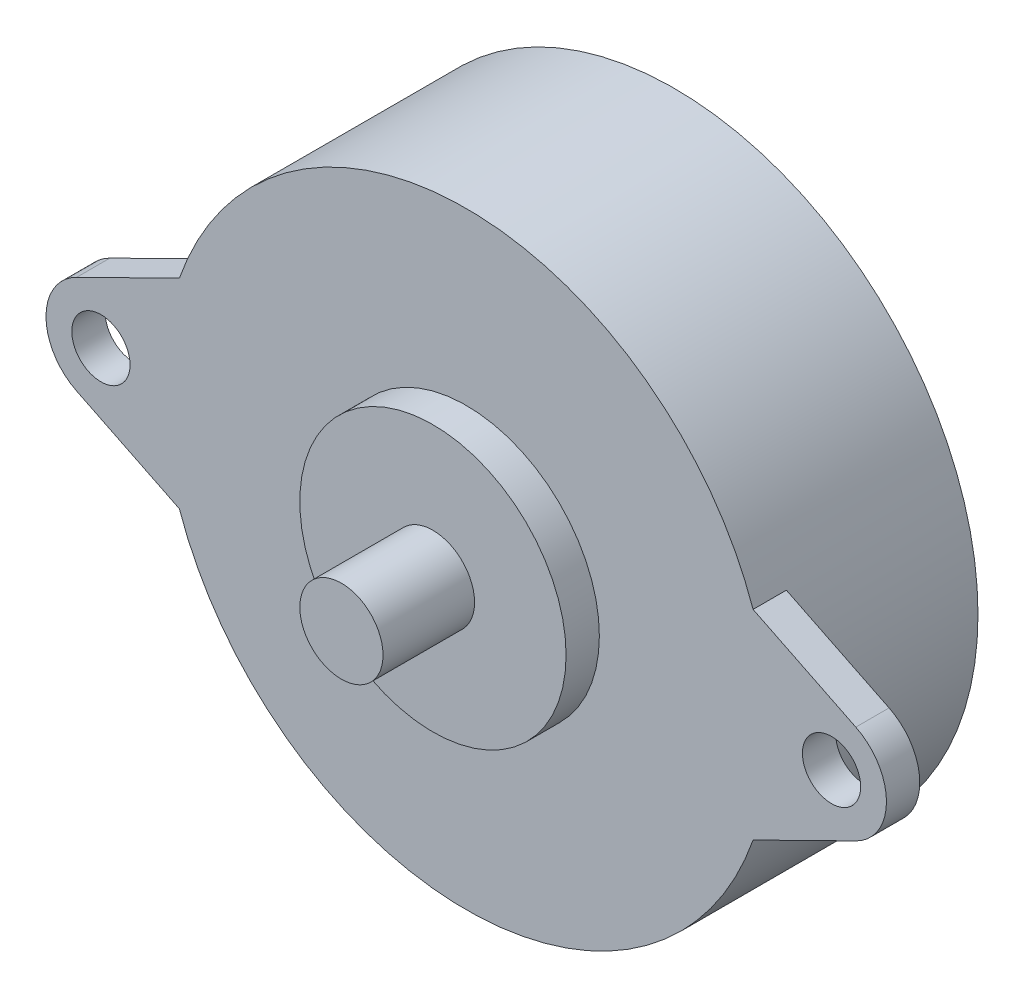
ISO-10303-21;
HEADER;
FILE_DESCRIPTION(('STEP AP214'),'2;1');
FILE_NAME('part.step','',(''),(''),'','','');
FILE_SCHEMA(('AUTOMOTIVE_DESIGN { 1 0 10303 214 1 1 1 1 }'));
ENDSEC;
DATA;
#1=APPLICATION_CONTEXT('core data for automotive mechanical design processes');
#2=APPLICATION_PROTOCOL_DEFINITION('international standard','automotive_design',2000,#1);
#3=PRODUCT_CONTEXT('',#1,'mechanical');
#4=PRODUCT('Part','Part','',(#3));
#5=PRODUCT_RELATED_PRODUCT_CATEGORY('part','',(#4));
#6=PRODUCT_DEFINITION_FORMATION('','',#4);
#7=PRODUCT_DEFINITION_CONTEXT('part definition',#1,'design');
#8=PRODUCT_DEFINITION('design','',#6,#7);
#9=PRODUCT_DEFINITION_SHAPE('','',#8);
#10=(LENGTH_UNIT() NAMED_UNIT(*) SI_UNIT(.MILLI.,.METRE.));
#11=(NAMED_UNIT(*) PLANE_ANGLE_UNIT() SI_UNIT($,.RADIAN.));
#12=(NAMED_UNIT(*) SI_UNIT($,.STERADIAN.) SOLID_ANGLE_UNIT());
#13=UNCERTAINTY_MEASURE_WITH_UNIT(LENGTH_MEASURE(1.E-05),#10,'distance_accuracy_value','');
#14=(GEOMETRIC_REPRESENTATION_CONTEXT(3) GLOBAL_UNCERTAINTY_ASSIGNED_CONTEXT((#13)) GLOBAL_UNIT_ASSIGNED_CONTEXT((#10,
#11,#12)) REPRESENTATION_CONTEXT('',''));
#15=CARTESIAN_POINT('',(0.,0.,0.));
#16=DIRECTION('',(0.,0.,1.));
#17=DIRECTION('',(1.,0.,0.));
#18=AXIS2_PLACEMENT_3D('',#15,#16,#17);
#19=CARTESIAN_POINT('',(0.,0.,12.5));
#20=DIRECTION('',(0.,0.,-1.));
#21=DIRECTION('',(-1.,0.,0.));
#22=AXIS2_PLACEMENT_3D('',#19,#20,#21);
#23=CYLINDRICAL_SURFACE('',#22,18.25);
#24=CARTESIAN_POINT('',(0.,0.,10.5));
#25=DIRECTION('',(0.,0.,-1.));
#26=DIRECTION('',(-1.,0.,0.));
#27=AXIS2_PLACEMENT_3D('',#24,#25,#26);
#28=CIRCLE('',#27,18.25);
#29=CARTESIAN_POINT('',(17.2355011531432,6.,10.5));
#30=VERTEX_POINT('',#29);
#31=CARTESIAN_POINT('',(17.2355011531432,-6.,10.5));
#32=VERTEX_POINT('',#31);
#33=EDGE_CURVE('E121',#30,#32,#28,.T.);
#34=ORIENTED_EDGE('',*,*,#33,.T.);
#35=DIRECTION('',(0.,0.,1.));
#36=VECTOR('',#35,1.);
#37=CARTESIAN_POINT('',(17.2355011531432,-6.,10.5));
#38=LINE('',#37,#36);
#39=CARTESIAN_POINT('',(17.2355011531432,-6.,12.5));
#40=VERTEX_POINT('',#39);
#41=EDGE_CURVE('E141',#32,#40,#38,.T.);
#42=ORIENTED_EDGE('',*,*,#41,.T.);
#43=CARTESIAN_POINT('',(0.,0.,12.5));
#44=DIRECTION('',(0.,0.,1.));
#45=DIRECTION('',(1.,0.,0.));
#46=AXIS2_PLACEMENT_3D('',#43,#44,#45);
#47=CIRCLE('',#46,18.25);
#48=CARTESIAN_POINT('',(-17.2355011531432,-6.,12.5));
#49=VERTEX_POINT('',#48);
#50=EDGE_CURVE('E176',#49,#40,#47,.T.);
#51=ORIENTED_EDGE('',*,*,#50,.F.);
#52=DIRECTION('',(0.,0.,1.));
#53=VECTOR('',#52,1.);
#54=CARTESIAN_POINT('',(-17.2355011531432,-6.,10.5));
#55=LINE('',#54,#53);
#56=CARTESIAN_POINT('',(-17.2355011531432,-6.,10.5));
#57=VERTEX_POINT('',#56);
#58=EDGE_CURVE('E174',#57,#49,#55,.T.);
#59=ORIENTED_EDGE('',*,*,#58,.F.);
#60=CARTESIAN_POINT('',(0.,0.,10.5));
#61=DIRECTION('',(0.,0.,-1.));
#62=DIRECTION('',(1.,0.,0.));
#63=AXIS2_PLACEMENT_3D('',#60,#61,#62);
#64=CIRCLE('',#63,18.25);
#65=CARTESIAN_POINT('',(-17.2355011531432,6.,10.5));
#66=VERTEX_POINT('',#65);
#67=EDGE_CURVE('E158',#57,#66,#64,.T.);
#68=ORIENTED_EDGE('',*,*,#67,.T.);
#69=DIRECTION('',(0.,0.,1.));
#70=VECTOR('',#69,1.);
#71=CARTESIAN_POINT('',(-17.2355011531432,6.,10.5));
#72=LINE('',#71,#70);
#73=CARTESIAN_POINT('',(-17.2355011531432,6.,12.5));
#74=VERTEX_POINT('',#73);
#75=EDGE_CURVE('E171',#66,#74,#72,.T.);
#76=ORIENTED_EDGE('',*,*,#75,.T.);
#77=CARTESIAN_POINT('',(17.2355011531432,6.,12.5));
#78=VERTEX_POINT('',#77);
#79=EDGE_CURVE('E177',#78,#74,#47,.T.);
#80=ORIENTED_EDGE('',*,*,#79,.F.);
#81=DIRECTION('',(0.,0.,1.));
#82=VECTOR('',#81,1.);
#83=CARTESIAN_POINT('',(17.2355011531432,6.,10.5));
#84=LINE('',#83,#82);
#85=EDGE_CURVE('E111',#30,#78,#84,.T.);
#86=ORIENTED_EDGE('',*,*,#85,.F.);
#87=EDGE_LOOP('',(#34,#42,#51,#59,#68,#76,#80,#86));
#88=FACE_BOUND('',#87,.T.);
#89=CARTESIAN_POINT('',(0.,0.,0.));
#90=DIRECTION('',(0.,0.,1.));
#91=DIRECTION('',(1.,0.,0.));
#92=AXIS2_PLACEMENT_3D('',#89,#90,#91);
#93=CIRCLE('',#92,18.25);
#94=CARTESIAN_POINT('',(18.25,0.,0.));
#95=VERTEX_POINT('',#94);
#96=EDGE_CURVE('E39',#95,#95,#93,.T.);
#97=ORIENTED_EDGE('',*,*,#96,.T.);
#98=EDGE_LOOP('',(#97));
#99=FACE_BOUND('',#98,.T.);
#100=ADVANCED_FACE('F36',(#88,#99),#23,.T.);
#101=CARTESIAN_POINT('',(0.,0.,12.5));
#102=DIRECTION('',(0.,0.,1.));
#103=DIRECTION('',(1.,0.,0.));
#104=AXIS2_PLACEMENT_3D('',#101,#102,#103);
#105=PLANE('',#104);
#106=CARTESIAN_POINT('',(0.,0.,12.5));
#107=DIRECTION('',(0.,0.,1.));
#108=DIRECTION('',(1.,0.,0.));
#109=AXIS2_PLACEMENT_3D('',#106,#107,#108);
#110=CIRCLE('',#109,8.);
#111=CARTESIAN_POINT('',(8.,0.,12.5));
#112=VERTEX_POINT('',#111);
#113=EDGE_CURVE('E44',#112,#112,#110,.T.);
#114=ORIENTED_EDGE('',*,*,#113,.F.);
#115=EDGE_LOOP('',(#114));
#116=FACE_BOUND('',#115,.T.);
#117=ORIENTED_EDGE('',*,*,#50,.T.);
#118=DIRECTION('',(0.89712539673719,0.441775986818137,0.));
#119=VECTOR('',#118,1.);
#120=CARTESIAN_POINT('',(23.4078607564999,-2.96051380923273,12.5));
#121=LINE('',#120,#119);
#122=CARTESIAN_POINT('',(23.4078607564999,-2.96051380923273,12.5));
#123=VERTEX_POINT('',#122);
#124=EDGE_CURVE('E125',#40,#123,#121,.T.);
#125=ORIENTED_EDGE('',*,*,#124,.T.);
#126=CARTESIAN_POINT('',(21.95,0.,12.5));
#127=DIRECTION('',(0.,0.,1.));
#128=DIRECTION('',(-1.,0.,0.));
#129=AXIS2_PLACEMENT_3D('',#126,#127,#128);
#130=CIRCLE('',#129,3.3);
#131=CARTESIAN_POINT('',(23.4078607564999,2.96051380923273,12.5));
#132=VERTEX_POINT('',#131);
#133=EDGE_CURVE('E135',#123,#132,#130,.T.);
#134=ORIENTED_EDGE('',*,*,#133,.T.);
#135=DIRECTION('',(-0.89712539673719,0.441775986818137,0.));
#136=VECTOR('',#135,1.);
#137=CARTESIAN_POINT('',(23.4078607564999,2.96051380923273,12.5));
#138=LINE('',#137,#136);
#139=EDGE_CURVE('E52',#132,#78,#138,.T.);
#140=ORIENTED_EDGE('',*,*,#139,.T.);
#141=ORIENTED_EDGE('',*,*,#79,.T.);
#142=DIRECTION('',(-0.89712539673719,-0.441775986818137,0.));
#143=VECTOR('',#142,1.);
#144=CARTESIAN_POINT('',(-23.4078607564999,2.96051380923273,12.5));
#145=LINE('',#144,#143);
#146=CARTESIAN_POINT('',(-23.4078607564999,2.96051380923273,12.5));
#147=VERTEX_POINT('',#146);
#148=EDGE_CURVE('E155',#74,#147,#145,.T.);
#149=ORIENTED_EDGE('',*,*,#148,.T.);
#150=CARTESIAN_POINT('',(-21.95,0.,12.5));
#151=DIRECTION('',(0.,0.,1.));
#152=DIRECTION('',(1.,0.,0.));
#153=AXIS2_PLACEMENT_3D('',#150,#151,#152);
#154=CIRCLE('',#153,3.3);
#155=CARTESIAN_POINT('',(-23.4078607564999,-2.96051380923273,12.5));
#156=VERTEX_POINT('',#155);
#157=EDGE_CURVE('E148',#147,#156,#154,.T.);
#158=ORIENTED_EDGE('',*,*,#157,.T.);
#159=DIRECTION('',(0.89712539673719,-0.441775986818137,0.));
#160=VECTOR('',#159,1.);
#161=CARTESIAN_POINT('',(-23.4078607564999,-2.96051380923273,12.5));
#162=LINE('',#161,#160);
#163=EDGE_CURVE('E59',#156,#49,#162,.T.);
#164=ORIENTED_EDGE('',*,*,#163,.T.);
#165=EDGE_LOOP('',(#117,#125,#134,#140,#141,#149,#158,#164));
#166=FACE_BOUND('',#165,.T.);
#167=CARTESIAN_POINT('',(-21.95,0.,12.5));
#168=DIRECTION('',(0.,0.,1.));
#169=DIRECTION('',(1.,0.,0.));
#170=AXIS2_PLACEMENT_3D('',#167,#168,#169);
#171=CIRCLE('',#170,1.75);
#172=CARTESIAN_POINT('',(-20.2,0.,12.5));
#173=VERTEX_POINT('',#172);
#174=EDGE_CURVE('E140',#173,#173,#171,.T.);
#175=ORIENTED_EDGE('',*,*,#174,.F.);
#176=EDGE_LOOP('',(#175));
#177=FACE_BOUND('',#176,.T.);
#178=CARTESIAN_POINT('',(21.95,0.,12.5));
#179=DIRECTION('',(0.,0.,1.));
#180=DIRECTION('',(1.,0.,0.));
#181=AXIS2_PLACEMENT_3D('',#178,#179,#180);
#182=CIRCLE('',#181,1.75);
#183=CARTESIAN_POINT('',(23.7,0.,12.5));
#184=VERTEX_POINT('',#183);
#185=EDGE_CURVE('E130',#184,#184,#182,.T.);
#186=ORIENTED_EDGE('',*,*,#185,.F.);
#187=EDGE_LOOP('',(#186));
#188=FACE_BOUND('',#187,.T.);
#189=ADVANCED_FACE('F190',(#116,#166,#177,#188),#105,.T.);
#190=CARTESIAN_POINT('',(0.,0.,0.));
#191=DIRECTION('',(0.,0.,1.));
#192=DIRECTION('',(1.,0.,0.));
#193=AXIS2_PLACEMENT_3D('',#190,#191,#192);
#194=PLANE('',#193);
#195=ORIENTED_EDGE('',*,*,#96,.F.);
#196=EDGE_LOOP('',(#195));
#197=FACE_BOUND('',#196,.T.);
#198=ADVANCED_FACE('F187',(#197),#194,.F.);
#199=CARTESIAN_POINT('',(-21.95,0.,10.5));
#200=DIRECTION('',(0.,0.,1.));
#201=DIRECTION('',(1.,0.,0.));
#202=AXIS2_PLACEMENT_3D('',#199,#200,#201);
#203=CYLINDRICAL_SURFACE('',#202,3.3);
#204=ORIENTED_EDGE('',*,*,#157,.F.);
#205=DIRECTION('',(0.,0.,1.));
#206=VECTOR('',#205,1.);
#207=CARTESIAN_POINT('',(-23.4078607564999,2.96051380923273,10.5));
#208=LINE('',#207,#206);
#209=CARTESIAN_POINT('',(-23.4078607564999,2.96051380923273,10.5));
#210=VERTEX_POINT('',#209);
#211=EDGE_CURVE('E169',#210,#147,#208,.T.);
#212=ORIENTED_EDGE('',*,*,#211,.F.);
#213=CARTESIAN_POINT('',(-21.95,0.,10.5));
#214=DIRECTION('',(0.,0.,1.));
#215=DIRECTION('',(1.,0.,0.));
#216=AXIS2_PLACEMENT_3D('',#213,#214,#215);
#217=CIRCLE('',#216,3.3);
#218=CARTESIAN_POINT('',(-23.4078607564999,-2.96051380923273,10.5));
#219=VERTEX_POINT('',#218);
#220=EDGE_CURVE('E151',#210,#219,#217,.T.);
#221=ORIENTED_EDGE('',*,*,#220,.T.);
#222=DIRECTION('',(0.,0.,1.));
#223=VECTOR('',#222,1.);
#224=CARTESIAN_POINT('',(-23.4078607564999,-2.96051380923273,10.5));
#225=LINE('',#224,#223);
#226=EDGE_CURVE('E164',#219,#156,#225,.T.);
#227=ORIENTED_EDGE('',*,*,#226,.T.);
#228=EDGE_LOOP('',(#204,#212,#221,#227));
#229=FACE_BOUND('',#228,.T.);
#230=ADVANCED_FACE('F189',(#229),#203,.T.);
#231=CARTESIAN_POINT('',(-23.4078607564999,2.96051380923273,10.5));
#232=DIRECTION('',(-0.441775986818137,0.89712539673719,0.));
#233=DIRECTION('',(-0.89712539673719,-0.441775986818137,0.));
#234=AXIS2_PLACEMENT_3D('',#231,#232,#233);
#235=PLANE('',#234);
#236=ORIENTED_EDGE('',*,*,#148,.F.);
#237=ORIENTED_EDGE('',*,*,#75,.F.);
#238=DIRECTION('',(-0.89712539673719,-0.441775986818137,0.));
#239=VECTOR('',#238,1.);
#240=CARTESIAN_POINT('',(-23.4078607564999,2.96051380923273,10.5));
#241=LINE('',#240,#239);
#242=EDGE_CURVE('E161',#66,#210,#241,.T.);
#243=ORIENTED_EDGE('',*,*,#242,.T.);
#244=ORIENTED_EDGE('',*,*,#211,.T.);
#245=EDGE_LOOP('',(#236,#237,#243,#244));
#246=FACE_BOUND('',#245,.T.);
#247=ADVANCED_FACE('F195',(#246),#235,.T.);
#248=CARTESIAN_POINT('',(-23.4078607564999,-2.96051380923273,10.5));
#249=DIRECTION('',(-0.441775986818137,-0.89712539673719,0.));
#250=DIRECTION('',(0.89712539673719,-0.441775986818137,0.));
#251=AXIS2_PLACEMENT_3D('',#248,#249,#250);
#252=PLANE('',#251);
#253=ORIENTED_EDGE('',*,*,#163,.F.);
#254=ORIENTED_EDGE('',*,*,#226,.F.);
#255=DIRECTION('',(0.89712539673719,-0.441775986818137,0.));
#256=VECTOR('',#255,1.);
#257=CARTESIAN_POINT('',(-23.4078607564999,-2.96051380923273,10.5));
#258=LINE('',#257,#256);
#259=EDGE_CURVE('E154',#219,#57,#258,.T.);
#260=ORIENTED_EDGE('',*,*,#259,.T.);
#261=ORIENTED_EDGE('',*,*,#58,.T.);
#262=EDGE_LOOP('',(#253,#254,#260,#261));
#263=FACE_BOUND('',#262,.T.);
#264=ADVANCED_FACE('F269',(#263),#252,.T.);
#265=CARTESIAN_POINT('',(-21.95,0.,10.5));
#266=DIRECTION('',(0.,0.,1.));
#267=DIRECTION('',(1.,0.,0.));
#268=AXIS2_PLACEMENT_3D('',#265,#266,#267);
#269=PLANE('',#268);
#270=CARTESIAN_POINT('',(-21.95,0.,10.5));
#271=DIRECTION('',(0.,0.,1.));
#272=DIRECTION('',(1.,0.,0.));
#273=AXIS2_PLACEMENT_3D('',#270,#271,#272);
#274=CIRCLE('',#273,1.75);
#275=CARTESIAN_POINT('',(-20.2,0.,10.5));
#276=VERTEX_POINT('',#275);
#277=EDGE_CURVE('E145',#276,#276,#274,.T.);
#278=ORIENTED_EDGE('',*,*,#277,.T.);
#279=EDGE_LOOP('',(#278));
#280=FACE_BOUND('',#279,.T.);
#281=ORIENTED_EDGE('',*,*,#220,.F.);
#282=ORIENTED_EDGE('',*,*,#242,.F.);
#283=ORIENTED_EDGE('',*,*,#67,.F.);
#284=ORIENTED_EDGE('',*,*,#259,.F.);
#285=EDGE_LOOP('',(#281,#282,#283,#284));
#286=FACE_BOUND('',#285,.T.);
#287=ADVANCED_FACE('F209',(#280,#286),#269,.F.);
#288=CARTESIAN_POINT('',(-21.95,0.,10.5));
#289=DIRECTION('',(0.,0.,1.));
#290=DIRECTION('',(1.,0.,0.));
#291=AXIS2_PLACEMENT_3D('',#288,#289,#290);
#292=CYLINDRICAL_SURFACE('',#291,1.75);
#293=ORIENTED_EDGE('',*,*,#277,.F.);
#294=EDGE_LOOP('',(#293));
#295=FACE_BOUND('',#294,.T.);
#296=ORIENTED_EDGE('',*,*,#174,.T.);
#297=EDGE_LOOP('',(#296));
#298=FACE_BOUND('',#297,.T.);
#299=ADVANCED_FACE('F263',(#295,#298),#292,.F.);
#300=CARTESIAN_POINT('',(21.95,0.,10.5));
#301=DIRECTION('',(0.,0.,1.));
#302=DIRECTION('',(1.,0.,0.));
#303=AXIS2_PLACEMENT_3D('',#300,#301,#302);
#304=CYLINDRICAL_SURFACE('',#303,3.3);
#305=ORIENTED_EDGE('',*,*,#133,.F.);
#306=DIRECTION('',(0.,0.,1.));
#307=VECTOR('',#306,1.);
#308=CARTESIAN_POINT('',(23.4078607564999,-2.96051380923273,10.5));
#309=LINE('',#308,#307);
#310=CARTESIAN_POINT('',(23.4078607564999,-2.96051380923273,10.5));
#311=VERTEX_POINT('',#310);
#312=EDGE_CURVE('E124',#311,#123,#309,.T.);
#313=ORIENTED_EDGE('',*,*,#312,.F.);
#314=CARTESIAN_POINT('',(21.95,0.,10.5));
#315=DIRECTION('',(0.,0.,1.));
#316=DIRECTION('',(-1.,0.,0.));
#317=AXIS2_PLACEMENT_3D('',#314,#315,#316);
#318=CIRCLE('',#317,3.3);
#319=CARTESIAN_POINT('',(23.4078607564999,2.96051380923273,10.5));
#320=VERTEX_POINT('',#319);
#321=EDGE_CURVE('E118',#311,#320,#318,.T.);
#322=ORIENTED_EDGE('',*,*,#321,.T.);
#323=DIRECTION('',(0.,0.,1.));
#324=VECTOR('',#323,1.);
#325=CARTESIAN_POINT('',(23.4078607564999,2.96051380923273,10.5));
#326=LINE('',#325,#324);
#327=EDGE_CURVE('E103',#320,#132,#326,.T.);
#328=ORIENTED_EDGE('',*,*,#327,.T.);
#329=EDGE_LOOP('',(#305,#313,#322,#328));
#330=FACE_BOUND('',#329,.T.);
#331=ADVANCED_FACE('F123',(#330),#304,.T.);
#332=CARTESIAN_POINT('',(23.4078607564999,-2.96051380923273,10.5));
#333=DIRECTION('',(0.441775986818137,-0.89712539673719,0.));
#334=DIRECTION('',(0.89712539673719,0.441775986818137,0.));
#335=AXIS2_PLACEMENT_3D('',#332,#333,#334);
#336=PLANE('',#335);
#337=ORIENTED_EDGE('',*,*,#124,.F.);
#338=ORIENTED_EDGE('',*,*,#41,.F.);
#339=DIRECTION('',(0.89712539673719,0.441775986818137,0.));
#340=VECTOR('',#339,1.);
#341=CARTESIAN_POINT('',(23.4078607564999,-2.96051380923273,10.5));
#342=LINE('',#341,#340);
#343=EDGE_CURVE('E112',#32,#311,#342,.T.);
#344=ORIENTED_EDGE('',*,*,#343,.T.);
#345=ORIENTED_EDGE('',*,*,#312,.T.);
#346=EDGE_LOOP('',(#337,#338,#344,#345));
#347=FACE_BOUND('',#346,.T.);
#348=ADVANCED_FACE('F255',(#347),#336,.T.);
#349=CARTESIAN_POINT('',(23.4078607564999,2.96051380923273,10.5));
#350=DIRECTION('',(0.441775986818137,0.89712539673719,0.));
#351=DIRECTION('',(-0.89712539673719,0.441775986818137,0.));
#352=AXIS2_PLACEMENT_3D('',#349,#350,#351);
#353=PLANE('',#352);
#354=ORIENTED_EDGE('',*,*,#139,.F.);
#355=ORIENTED_EDGE('',*,*,#327,.F.);
#356=DIRECTION('',(-0.89712539673719,0.441775986818137,0.));
#357=VECTOR('',#356,1.);
#358=CARTESIAN_POINT('',(23.4078607564999,2.96051380923273,10.5));
#359=LINE('',#358,#357);
#360=EDGE_CURVE('E106',#320,#30,#359,.T.);
#361=ORIENTED_EDGE('',*,*,#360,.T.);
#362=ORIENTED_EDGE('',*,*,#85,.T.);
#363=EDGE_LOOP('',(#354,#355,#361,#362));
#364=FACE_BOUND('',#363,.T.);
#365=ADVANCED_FACE('F105',(#364),#353,.T.);
#366=CARTESIAN_POINT('',(21.95,0.,10.5));
#367=DIRECTION('',(0.,0.,-1.));
#368=DIRECTION('',(-1.,0.,0.));
#369=AXIS2_PLACEMENT_3D('',#366,#367,#368);
#370=PLANE('',#369);
#371=CARTESIAN_POINT('',(21.95,0.,10.5));
#372=DIRECTION('',(0.,0.,1.));
#373=DIRECTION('',(1.,0.,0.));
#374=AXIS2_PLACEMENT_3D('',#371,#372,#373);
#375=CIRCLE('',#374,1.75);
#376=CARTESIAN_POINT('',(23.7,0.,10.5));
#377=VERTEX_POINT('',#376);
#378=EDGE_CURVE('E137',#377,#377,#375,.T.);
#379=ORIENTED_EDGE('',*,*,#378,.T.);
#380=EDGE_LOOP('',(#379));
#381=FACE_BOUND('',#380,.T.);
#382=ORIENTED_EDGE('',*,*,#321,.F.);
#383=ORIENTED_EDGE('',*,*,#343,.F.);
#384=ORIENTED_EDGE('',*,*,#33,.F.);
#385=ORIENTED_EDGE('',*,*,#360,.F.);
#386=EDGE_LOOP('',(#382,#383,#384,#385));
#387=FACE_BOUND('',#386,.T.);
#388=ADVANCED_FACE('F116',(#381,#387),#370,.T.);
#389=CARTESIAN_POINT('',(21.95,0.,10.5));
#390=DIRECTION('',(0.,0.,1.));
#391=DIRECTION('',(1.,0.,0.));
#392=AXIS2_PLACEMENT_3D('',#389,#390,#391);
#393=CYLINDRICAL_SURFACE('',#392,1.75);
#394=ORIENTED_EDGE('',*,*,#378,.F.);
#395=EDGE_LOOP('',(#394));
#396=FACE_BOUND('',#395,.T.);
#397=ORIENTED_EDGE('',*,*,#185,.T.);
#398=EDGE_LOOP('',(#397));
#399=FACE_BOUND('',#398,.T.);
#400=ADVANCED_FACE('F244',(#396,#399),#393,.F.);
#401=CARTESIAN_POINT('',(0.,0.,14.5));
#402=DIRECTION('',(0.,0.,-1.));
#403=DIRECTION('',(-1.,0.,0.));
#404=AXIS2_PLACEMENT_3D('',#401,#402,#403);
#405=CYLINDRICAL_SURFACE('',#404,8.);
#406=CARTESIAN_POINT('',(0.,0.,14.5));
#407=DIRECTION('',(0.,0.,1.));
#408=DIRECTION('',(1.,0.,0.));
#409=AXIS2_PLACEMENT_3D('',#406,#407,#408);
#410=CIRCLE('',#409,8.);
#411=CARTESIAN_POINT('',(8.,0.,14.5));
#412=VERTEX_POINT('',#411);
#413=EDGE_CURVE('E218',#412,#412,#410,.T.);
#414=ORIENTED_EDGE('',*,*,#413,.F.);
#415=EDGE_LOOP('',(#414));
#416=FACE_BOUND('',#415,.T.);
#417=ORIENTED_EDGE('',*,*,#113,.T.);
#418=EDGE_LOOP('',(#417));
#419=FACE_BOUND('',#418,.T.);
#420=ADVANCED_FACE('F239',(#416,#419),#405,.T.);
#421=CARTESIAN_POINT('',(0.,0.,14.5));
#422=DIRECTION('',(0.,0.,1.));
#423=DIRECTION('',(1.,0.,0.));
#424=AXIS2_PLACEMENT_3D('',#421,#422,#423);
#425=PLANE('',#424);
#426=CARTESIAN_POINT('',(0.,0.,14.5));
#427=DIRECTION('',(0.,0.,1.));
#428=DIRECTION('',(1.,0.,0.));
#429=AXIS2_PLACEMENT_3D('',#426,#427,#428);
#430=CIRCLE('',#429,2.5);
#431=CARTESIAN_POINT('',(2.5,0.,14.5));
#432=VERTEX_POINT('',#431);
#433=EDGE_CURVE('E11',#432,#432,#430,.T.);
#434=ORIENTED_EDGE('',*,*,#433,.F.);
#435=EDGE_LOOP('',(#434));
#436=FACE_BOUND('',#435,.T.);
#437=ORIENTED_EDGE('',*,*,#413,.T.);
#438=EDGE_LOOP('',(#437));
#439=FACE_BOUND('',#438,.T.);
#440=ADVANCED_FACE('F234',(#436,#439),#425,.T.);
#441=CARTESIAN_POINT('',(0.,0.,20.));
#442=DIRECTION('',(0.,0.,-1.));
#443=DIRECTION('',(-1.,0.,0.));
#444=AXIS2_PLACEMENT_3D('',#441,#442,#443);
#445=CYLINDRICAL_SURFACE('',#444,2.5);
#446=CARTESIAN_POINT('',(0.,0.,20.));
#447=DIRECTION('',(0.,0.,1.));
#448=DIRECTION('',(1.,0.,0.));
#449=AXIS2_PLACEMENT_3D('',#446,#447,#448);
#450=CIRCLE('',#449,2.5);
#451=CARTESIAN_POINT('',(2.5,0.,20.));
#452=VERTEX_POINT('',#451);
#453=EDGE_CURVE('E221',#452,#452,#450,.T.);
#454=ORIENTED_EDGE('',*,*,#453,.F.);
#455=EDGE_LOOP('',(#454));
#456=FACE_BOUND('',#455,.T.);
#457=ORIENTED_EDGE('',*,*,#433,.T.);
#458=EDGE_LOOP('',(#457));
#459=FACE_BOUND('',#458,.T.);
#460=ADVANCED_FACE('F231',(#456,#459),#445,.T.);
#461=CARTESIAN_POINT('',(0.,0.,20.));
#462=DIRECTION('',(0.,0.,1.));
#463=DIRECTION('',(1.,0.,0.));
#464=AXIS2_PLACEMENT_3D('',#461,#462,#463);
#465=PLANE('',#464);
#466=ORIENTED_EDGE('',*,*,#453,.T.);
#467=EDGE_LOOP('',(#466));
#468=FACE_BOUND('',#467,.T.);
#469=ADVANCED_FACE('F229',(#468),#465,.T.);
#470=CLOSED_SHELL('',(#100,#189,#198,#230,#247,#264,#287,#299,#331,#348,#365,#388,#400,#420,
#440,#460,#469));
#471=MANIFOLD_SOLID_BREP('B2',#470);
#472=ADVANCED_BREP_SHAPE_REPRESENTATION('',(#18,#471),#14);
#473=SHAPE_DEFINITION_REPRESENTATION(#9,#472);
ENDSEC;
END-ISO-10303-21;
